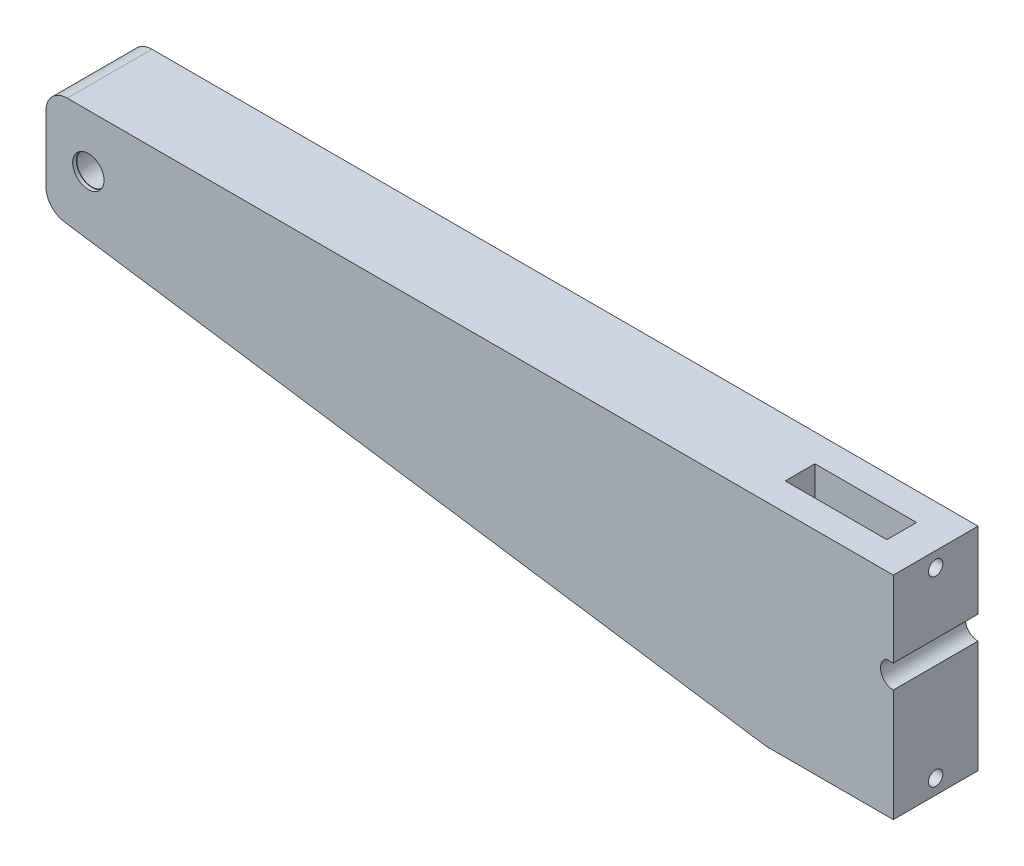
ISO-10303-21;
HEADER;
FILE_DESCRIPTION(('STEP AP214'),'2;1');
FILE_NAME('part.step','',(''),(''),'','','');
FILE_SCHEMA(('AUTOMOTIVE_DESIGN { 1 0 10303 214 1 1 1 1 }'));
ENDSEC;
DATA;
#1=APPLICATION_CONTEXT('core data for automotive mechanical design processes');
#2=APPLICATION_PROTOCOL_DEFINITION('international standard','automotive_design',2000,#1);
#3=PRODUCT_CONTEXT('',#1,'mechanical');
#4=PRODUCT('Part','Part','',(#3));
#5=PRODUCT_RELATED_PRODUCT_CATEGORY('part','',(#4));
#6=PRODUCT_DEFINITION_FORMATION('','',#4);
#7=PRODUCT_DEFINITION_CONTEXT('part definition',#1,'design');
#8=PRODUCT_DEFINITION('design','',#6,#7);
#9=PRODUCT_DEFINITION_SHAPE('','',#8);
#10=(LENGTH_UNIT() NAMED_UNIT(*) SI_UNIT(.MILLI.,.METRE.));
#11=(NAMED_UNIT(*) PLANE_ANGLE_UNIT() SI_UNIT($,.RADIAN.));
#12=(NAMED_UNIT(*) SI_UNIT($,.STERADIAN.) SOLID_ANGLE_UNIT());
#13=UNCERTAINTY_MEASURE_WITH_UNIT(LENGTH_MEASURE(1.E-05),#10,'distance_accuracy_value','');
#14=(GEOMETRIC_REPRESENTATION_CONTEXT(3) GLOBAL_UNCERTAINTY_ASSIGNED_CONTEXT((#13)) GLOBAL_UNIT_ASSIGNED_CONTEXT((#10,
#11,#12)) REPRESENTATION_CONTEXT('',''));
#15=CARTESIAN_POINT('',(0.,0.,0.));
#16=DIRECTION('',(0.,0.,1.));
#17=DIRECTION('',(1.,0.,0.));
#18=AXIS2_PLACEMENT_3D('',#15,#16,#17);
#19=CARTESIAN_POINT('',(-190.,37.5,20.));
#20=DIRECTION('',(0.,0.,-1.));
#21=DIRECTION('',(-1.,0.,0.));
#22=AXIS2_PLACEMENT_3D('',#19,#20,#21);
#23=CYLINDRICAL_SURFACE('',#22,3.575);
#24=CARTESIAN_POINT('',(-190.,37.5,19.15));
#25=DIRECTION('',(0.,0.,1.));
#26=DIRECTION('',(1.,0.,0.));
#27=AXIS2_PLACEMENT_3D('',#24,#25,#26);
#28=CIRCLE('',#27,3.575);
#29=CARTESIAN_POINT('',(-186.425,37.5,19.15));
#30=VERTEX_POINT('',#29);
#31=EDGE_CURVE('E326',#30,#30,#28,.T.);
#32=ORIENTED_EDGE('',*,*,#31,.T.);
#33=EDGE_LOOP('',(#32));
#34=FACE_BOUND('',#33,.T.);
#35=CARTESIAN_POINT('',(-190.,37.5,0.85));
#36=DIRECTION('',(0.,0.,-1.));
#37=DIRECTION('',(-1.,0.,0.));
#38=AXIS2_PLACEMENT_3D('',#35,#36,#37);
#39=CIRCLE('',#38,3.575);
#40=CARTESIAN_POINT('',(-193.575,37.5,0.85));
#41=VERTEX_POINT('',#40);
#42=EDGE_CURVE('E39',#41,#41,#39,.T.);
#43=ORIENTED_EDGE('',*,*,#42,.T.);
#44=EDGE_LOOP('',(#43));
#45=FACE_BOUND('',#44,.T.);
#46=ADVANCED_FACE('F35',(#34,#45),#23,.F.);
#47=CARTESIAN_POINT('',(-0.635055038103302,-4.31837425910245,20.));
#48=DIRECTION('',(-0.145493990494831,-0.989359135364853,0.));
#49=DIRECTION('',(0.989359135364853,-0.145493990494831,0.));
#50=AXIS2_PLACEMENT_3D('',#47,#48,#49);
#51=PLANE('',#50);
#52=DIRECTION('',(0.,0.,-1.));
#53=VECTOR('',#52,1.);
#54=CARTESIAN_POINT('',(-30.,0.,20.));
#55=LINE('',#54,#53);
#56=CARTESIAN_POINT('',(-30.,0.,6.5));
#57=VERTEX_POINT('',#56);
#58=CARTESIAN_POINT('',(-30.,0.,0.));
#59=VERTEX_POINT('',#58);
#60=EDGE_CURVE('E296',#57,#59,#55,.T.);
#61=ORIENTED_EDGE('',*,*,#60,.F.);
#62=DIRECTION('',(-0.989359135364853,0.145493990494831,0.));
#63=VECTOR('',#62,1.);
#64=CARTESIAN_POINT('',(-0.635055038103304,-4.31837425910245,6.5));
#65=LINE('',#64,#63);
#66=CARTESIAN_POINT('',(-32.,0.294117647058823,6.5));
#67=VERTEX_POINT('',#66);
#68=EDGE_CURVE('E208',#57,#67,#65,.T.);
#69=ORIENTED_EDGE('',*,*,#68,.T.);
#70=DIRECTION('',(0.,0.,1.));
#71=VECTOR('',#70,1.);
#72=CARTESIAN_POINT('',(-32.,0.294117647058823,20.));
#73=LINE('',#72,#71);
#74=CARTESIAN_POINT('',(-32.,0.294117647058824,13.5));
#75=VERTEX_POINT('',#74);
#76=EDGE_CURVE('E11',#67,#75,#73,.T.);
#77=ORIENTED_EDGE('',*,*,#76,.T.);
#78=DIRECTION('',(0.989359135364853,-0.145493990494831,0.));
#79=VECTOR('',#78,1.);
#80=CARTESIAN_POINT('',(-0.635055038103301,-4.31837425910245,13.5));
#81=LINE('',#80,#79);
#82=CARTESIAN_POINT('',(-30.,0.,13.5));
#83=VERTEX_POINT('',#82);
#84=EDGE_CURVE('E201',#75,#83,#81,.T.);
#85=ORIENTED_EDGE('',*,*,#84,.T.);
#86=CARTESIAN_POINT('',(-30.,0.,20.));
#87=VERTEX_POINT('',#86);
#88=EDGE_CURVE('E297',#87,#83,#55,.T.);
#89=ORIENTED_EDGE('',*,*,#88,.F.);
#90=DIRECTION('',(-0.989359135364853,0.145493990494831,0.));
#91=VECTOR('',#90,1.);
#92=CARTESIAN_POINT('',(-0.635055038103302,-4.31837425910245,20.));
#93=LINE('',#92,#91);
#94=CARTESIAN_POINT('',(-195.727469952474,24.3716867577168,20.));
#95=VERTEX_POINT('',#94);
#96=EDGE_CURVE('E263',#87,#95,#93,.T.);
#97=ORIENTED_EDGE('',*,*,#96,.T.);
#98=DIRECTION('',(0.,0.,-1.));
#99=VECTOR('',#98,1.);
#100=CARTESIAN_POINT('',(-195.727469952474,24.3716867577168,20.));
#101=LINE('',#100,#99);
#102=CARTESIAN_POINT('',(-195.727469952474,24.3716867577168,0.));
#103=VERTEX_POINT('',#102);
#104=EDGE_CURVE('E323',#95,#103,#101,.T.);
#105=ORIENTED_EDGE('',*,*,#104,.T.);
#106=DIRECTION('',(-0.989359135364853,0.145493990494831,0.));
#107=VECTOR('',#106,1.);
#108=CARTESIAN_POINT('',(-0.635055038103302,-4.31837425910245,0.));
#109=LINE('',#108,#107);
#110=EDGE_CURVE('E285',#59,#103,#109,.T.);
#111=ORIENTED_EDGE('',*,*,#110,.F.);
#112=EDGE_LOOP('',(#61,#69,#77,#85,#89,#97,#105,#111));
#113=FACE_BOUND('',#112,.T.);
#114=ADVANCED_FACE('F363',(#113),#51,.T.);
#115=CARTESIAN_POINT('',(0.,0.,20.));
#116=DIRECTION('',(0.,1.,0.));
#117=DIRECTION('',(0.,0.,1.));
#118=AXIS2_PLACEMENT_3D('',#115,#116,#117);
#119=PLANE('',#118);
#120=DIRECTION('',(-1.,0.,0.));
#121=VECTOR('',#120,1.);
#122=CARTESIAN_POINT('',(-8.,0.,6.5));
#123=LINE('',#122,#121);
#124=CARTESIAN_POINT('',(-8.,0.,6.5));
#125=VERTEX_POINT('',#124);
#126=EDGE_CURVE('E188',#125,#57,#123,.T.);
#127=ORIENTED_EDGE('',*,*,#126,.T.);
#128=ORIENTED_EDGE('',*,*,#60,.T.);
#129=DIRECTION('',(1.,0.,0.));
#130=VECTOR('',#129,1.);
#131=CARTESIAN_POINT('',(0.,0.,0.));
#132=LINE('',#131,#130);
#133=CARTESIAN_POINT('',(0.,0.,0.));
#134=VERTEX_POINT('',#133);
#135=EDGE_CURVE('E288',#59,#134,#132,.T.);
#136=ORIENTED_EDGE('',*,*,#135,.T.);
#137=DIRECTION('',(0.,0.,-1.));
#138=VECTOR('',#137,1.);
#139=CARTESIAN_POINT('',(0.,0.,20.));
#140=LINE('',#139,#138);
#141=CARTESIAN_POINT('',(0.,0.,20.));
#142=VERTEX_POINT('',#141);
#143=EDGE_CURVE('E294',#142,#134,#140,.T.);
#144=ORIENTED_EDGE('',*,*,#143,.F.);
#145=DIRECTION('',(1.,0.,0.));
#146=VECTOR('',#145,1.);
#147=CARTESIAN_POINT('',(0.,0.,20.));
#148=LINE('',#147,#146);
#149=EDGE_CURVE('E266',#87,#142,#148,.T.);
#150=ORIENTED_EDGE('',*,*,#149,.F.);
#151=ORIENTED_EDGE('',*,*,#88,.T.);
#152=DIRECTION('',(-1.,0.,0.));
#153=VECTOR('',#152,1.);
#154=CARTESIAN_POINT('',(0.,0.,13.5));
#155=LINE('',#154,#153);
#156=CARTESIAN_POINT('',(-8.,0.,13.5));
#157=VERTEX_POINT('',#156);
#158=EDGE_CURVE('E44',#157,#83,#155,.T.);
#159=ORIENTED_EDGE('',*,*,#158,.F.);
#160=DIRECTION('',(0.,0.,-1.));
#161=VECTOR('',#160,1.);
#162=CARTESIAN_POINT('',(-8.,0.,6.5));
#163=LINE('',#162,#161);
#164=EDGE_CURVE('E52',#157,#125,#163,.T.);
#165=ORIENTED_EDGE('',*,*,#164,.T.);
#166=EDGE_LOOP('',(#127,#128,#136,#144,#150,#151,#159,#165));
#167=FACE_BOUND('',#166,.T.);
#168=ADVANCED_FACE('F368',(#167),#119,.F.);
#169=CARTESIAN_POINT('',(0.,29.5,20.));
#170=DIRECTION('',(0.,0.,-1.));
#171=DIRECTION('',(-1.,0.,0.));
#172=AXIS2_PLACEMENT_3D('',#169,#170,#171);
#173=CYLINDRICAL_SURFACE('',#172,3.);
#174=CARTESIAN_POINT('',(0.,29.5,0.));
#175=DIRECTION('',(0.,0.,1.));
#176=DIRECTION('',(1.,0.,0.));
#177=AXIS2_PLACEMENT_3D('',#174,#175,#176);
#178=CIRCLE('',#177,3.);
#179=CARTESIAN_POINT('',(-1.65831239517769,32.,0.));
#180=VERTEX_POINT('',#179);
#181=CARTESIAN_POINT('',(0.,26.5,0.));
#182=VERTEX_POINT('',#181);
#183=EDGE_CURVE('E242',#180,#182,#178,.T.);
#184=ORIENTED_EDGE('',*,*,#183,.F.);
#185=DIRECTION('',(0.,0.,-1.));
#186=VECTOR('',#185,1.);
#187=CARTESIAN_POINT('',(-1.65831239517769,32.,20.));
#188=LINE('',#187,#186);
#189=CARTESIAN_POINT('',(-1.65831239517769,32.,20.));
#190=VERTEX_POINT('',#189);
#191=EDGE_CURVE('E306',#190,#180,#188,.T.);
#192=ORIENTED_EDGE('',*,*,#191,.F.);
#193=CARTESIAN_POINT('',(0.,29.5,20.));
#194=DIRECTION('',(0.,0.,1.));
#195=DIRECTION('',(1.,0.,0.));
#196=AXIS2_PLACEMENT_3D('',#193,#194,#195);
#197=CIRCLE('',#196,3.);
#198=CARTESIAN_POINT('',(0.,26.5,20.));
#199=VERTEX_POINT('',#198);
#200=EDGE_CURVE('E248',#190,#199,#197,.T.);
#201=ORIENTED_EDGE('',*,*,#200,.T.);
#202=DIRECTION('',(0.,0.,-1.));
#203=VECTOR('',#202,1.);
#204=CARTESIAN_POINT('',(0.,26.5,20.));
#205=LINE('',#204,#203);
#206=EDGE_CURVE('E271',#199,#182,#205,.T.);
#207=ORIENTED_EDGE('',*,*,#206,.T.);
#208=EDGE_LOOP('',(#184,#192,#201,#207));
#209=FACE_BOUND('',#208,.T.);
#210=ADVANCED_FACE('F372',(#209),#173,.F.);
#211=CARTESIAN_POINT('',(1.3389793477437E-13,32.,20.));
#212=DIRECTION('',(0.,1.,0.));
#213=DIRECTION('',(-1.,0.,0.));
#214=AXIS2_PLACEMENT_3D('',#211,#212,#213);
#215=PLANE('',#214);
#216=DIRECTION('',(1.,0.,0.));
#217=VECTOR('',#216,1.);
#218=CARTESIAN_POINT('',(1.3389793477437E-13,32.,0.));
#219=LINE('',#218,#217);
#220=CARTESIAN_POINT('',(0.,32.,0.));
#221=VERTEX_POINT('',#220);
#222=EDGE_CURVE('E274',#180,#221,#219,.T.);
#223=ORIENTED_EDGE('',*,*,#222,.T.);
#224=DIRECTION('',(0.,0.,-1.));
#225=VECTOR('',#224,1.);
#226=CARTESIAN_POINT('',(0.,32.,20.));
#227=LINE('',#226,#225);
#228=CARTESIAN_POINT('',(0.,32.,20.));
#229=VERTEX_POINT('',#228);
#230=EDGE_CURVE('E303',#229,#221,#227,.T.);
#231=ORIENTED_EDGE('',*,*,#230,.F.);
#232=DIRECTION('',(1.,0.,0.));
#233=VECTOR('',#232,1.);
#234=CARTESIAN_POINT('',(1.3389793477437E-13,32.,20.));
#235=LINE('',#234,#233);
#236=EDGE_CURVE('E251',#190,#229,#235,.T.);
#237=ORIENTED_EDGE('',*,*,#236,.F.);
#238=ORIENTED_EDGE('',*,*,#191,.T.);
#239=EDGE_LOOP('',(#223,#231,#237,#238));
#240=FACE_BOUND('',#239,.T.);
#241=ADVANCED_FACE('F416',(#240),#215,.F.);
#242=CARTESIAN_POINT('',(0.,0.,20.));
#243=DIRECTION('',(-1.,0.,0.));
#244=DIRECTION('',(0.,0.,1.));
#245=AXIS2_PLACEMENT_3D('',#242,#243,#244);
#246=PLANE('',#245);
#247=CARTESIAN_POINT('',(0.,46.5,10.));
#248=DIRECTION('',(-1.,0.,0.));
#249=DIRECTION('',(0.,0.,1.));
#250=AXIS2_PLACEMENT_3D('',#247,#248,#249);
#251=CIRCLE('',#250,1.7);
#252=CARTESIAN_POINT('',(0.,46.5,11.7));
#253=VERTEX_POINT('',#252);
#254=EDGE_CURVE('E214',#253,#253,#251,.F.);
#255=ORIENTED_EDGE('',*,*,#254,.F.);
#256=EDGE_LOOP('',(#255));
#257=FACE_BOUND('',#256,.T.);
#258=DIRECTION('',(0.,1.,0.));
#259=VECTOR('',#258,1.);
#260=CARTESIAN_POINT('',(0.,0.,0.));
#261=LINE('',#260,#259);
#262=CARTESIAN_POINT('',(0.,50.,0.));
#263=VERTEX_POINT('',#262);
#264=EDGE_CURVE('E277',#221,#263,#261,.T.);
#265=ORIENTED_EDGE('',*,*,#264,.T.);
#266=DIRECTION('',(0.,0.,-1.));
#267=VECTOR('',#266,1.);
#268=CARTESIAN_POINT('',(0.,50.,20.));
#269=LINE('',#268,#267);
#270=CARTESIAN_POINT('',(0.,50.,20.));
#271=VERTEX_POINT('',#270);
#272=EDGE_CURVE('E300',#271,#263,#269,.T.);
#273=ORIENTED_EDGE('',*,*,#272,.F.);
#274=DIRECTION('',(0.,1.,0.));
#275=VECTOR('',#274,1.);
#276=CARTESIAN_POINT('',(0.,0.,20.));
#277=LINE('',#276,#275);
#278=EDGE_CURVE('E255',#229,#271,#277,.T.);
#279=ORIENTED_EDGE('',*,*,#278,.F.);
#280=ORIENTED_EDGE('',*,*,#230,.T.);
#281=EDGE_LOOP('',(#265,#273,#279,#280));
#282=FACE_BOUND('',#281,.T.);
#283=ADVANCED_FACE('F419',(#257,#282),#246,.F.);
#284=CARTESIAN_POINT('',(0.,50.,20.));
#285=DIRECTION('',(0.,1.,0.));
#286=DIRECTION('',(0.,0.,1.));
#287=AXIS2_PLACEMENT_3D('',#284,#285,#286);
#288=PLANE('',#287);
#289=DIRECTION('',(0.,0.,-1.));
#290=VECTOR('',#289,1.);
#291=CARTESIAN_POINT('',(-8.,50.,6.5));
#292=LINE('',#291,#290);
#293=CARTESIAN_POINT('',(-8.,50.,13.5));
#294=VERTEX_POINT('',#293);
#295=CARTESIAN_POINT('',(-8.,50.,6.5));
#296=VERTEX_POINT('',#295);
#297=EDGE_CURVE('E60',#294,#296,#292,.T.);
#298=ORIENTED_EDGE('',*,*,#297,.F.);
#299=DIRECTION('',(1.,0.,0.));
#300=VECTOR('',#299,1.);
#301=CARTESIAN_POINT('',(-8.,50.,13.5));
#302=LINE('',#301,#300);
#303=CARTESIAN_POINT('',(-32.,50.,13.5));
#304=VERTEX_POINT('',#303);
#305=EDGE_CURVE('E221',#304,#294,#302,.T.);
#306=ORIENTED_EDGE('',*,*,#305,.F.);
#307=DIRECTION('',(0.,0.,1.));
#308=VECTOR('',#307,1.);
#309=CARTESIAN_POINT('',(-32.,50.,6.5));
#310=LINE('',#309,#308);
#311=CARTESIAN_POINT('',(-32.,50.,6.5));
#312=VERTEX_POINT('',#311);
#313=EDGE_CURVE('E235',#312,#304,#310,.T.);
#314=ORIENTED_EDGE('',*,*,#313,.F.);
#315=DIRECTION('',(-1.,0.,0.));
#316=VECTOR('',#315,1.);
#317=CARTESIAN_POINT('',(-8.,50.,6.5));
#318=LINE('',#317,#316);
#319=EDGE_CURVE('E232',#296,#312,#318,.T.);
#320=ORIENTED_EDGE('',*,*,#319,.F.);
#321=EDGE_LOOP('',(#298,#306,#314,#320));
#322=FACE_BOUND('',#321,.T.);
#323=DIRECTION('',(1.,0.,0.));
#324=VECTOR('',#323,1.);
#325=CARTESIAN_POINT('',(0.,50.,0.));
#326=LINE('',#325,#324);
#327=CARTESIAN_POINT('',(-195.,50.,0.));
#328=VERTEX_POINT('',#327);
#329=EDGE_CURVE('E280',#328,#263,#326,.T.);
#330=ORIENTED_EDGE('',*,*,#329,.F.);
#331=DIRECTION('',(0.,0.,-1.));
#332=VECTOR('',#331,1.);
#333=CARTESIAN_POINT('',(-195.,50.,20.));
#334=LINE('',#333,#332);
#335=CARTESIAN_POINT('',(-195.,50.,20.));
#336=VERTEX_POINT('',#335);
#337=EDGE_CURVE('E317',#328,#336,#334,.F.);
#338=ORIENTED_EDGE('',*,*,#337,.T.);
#339=DIRECTION('',(1.,0.,0.));
#340=VECTOR('',#339,1.);
#341=CARTESIAN_POINT('',(0.,50.,20.));
#342=LINE('',#341,#340);
#343=EDGE_CURVE('E258',#336,#271,#342,.T.);
#344=ORIENTED_EDGE('',*,*,#343,.T.);
#345=ORIENTED_EDGE('',*,*,#272,.T.);
#346=EDGE_LOOP('',(#330,#338,#344,#345));
#347=FACE_BOUND('',#346,.T.);
#348=ADVANCED_FACE('F422',(#322,#347),#288,.T.);
#349=CARTESIAN_POINT('',(-200.,0.,20.));
#350=DIRECTION('',(-1.,0.,0.));
#351=DIRECTION('',(0.,0.,1.));
#352=AXIS2_PLACEMENT_3D('',#349,#350,#351);
#353=PLANE('',#352);
#354=DIRECTION('',(0.,1.,0.));
#355=VECTOR('',#354,1.);
#356=CARTESIAN_POINT('',(-200.,0.,20.));
#357=LINE('',#356,#355);
#358=CARTESIAN_POINT('',(-200.,29.3184824345411,20.));
#359=VERTEX_POINT('',#358);
#360=CARTESIAN_POINT('',(-200.,45.,20.));
#361=VERTEX_POINT('',#360);
#362=EDGE_CURVE('E260',#359,#361,#357,.T.);
#363=ORIENTED_EDGE('',*,*,#362,.T.);
#364=DIRECTION('',(0.,0.,-1.));
#365=VECTOR('',#364,1.);
#366=CARTESIAN_POINT('',(-200.,45.,20.));
#367=LINE('',#366,#365);
#368=CARTESIAN_POINT('',(-200.,45.,0.));
#369=VERTEX_POINT('',#368);
#370=EDGE_CURVE('E310',#361,#369,#367,.T.);
#371=ORIENTED_EDGE('',*,*,#370,.T.);
#372=DIRECTION('',(0.,1.,0.));
#373=VECTOR('',#372,1.);
#374=CARTESIAN_POINT('',(-200.,0.,0.));
#375=LINE('',#374,#373);
#376=CARTESIAN_POINT('',(-200.,29.3184824345411,0.));
#377=VERTEX_POINT('',#376);
#378=EDGE_CURVE('E282',#377,#369,#375,.T.);
#379=ORIENTED_EDGE('',*,*,#378,.F.);
#380=DIRECTION('',(0.,0.,-1.));
#381=VECTOR('',#380,1.);
#382=CARTESIAN_POINT('',(-200.,29.3184824345411,20.));
#383=LINE('',#382,#381);
#384=EDGE_CURVE('E308',#377,#359,#383,.F.);
#385=ORIENTED_EDGE('',*,*,#384,.T.);
#386=EDGE_LOOP('',(#363,#371,#379,#385));
#387=FACE_BOUND('',#386,.T.);
#388=ADVANCED_FACE('F395',(#387),#353,.T.);
#389=CARTESIAN_POINT('',(0.,0.,20.));
#390=DIRECTION('',(1.,0.,0.));
#391=DIRECTION('',(0.,1.,0.));
#392=AXIS2_PLACEMENT_3D('',#389,#390,#391);
#393=PLANE('',#392);
#394=CARTESIAN_POINT('',(0.,3.5,10.));
#395=DIRECTION('',(-1.,0.,0.));
#396=DIRECTION('',(0.,0.,1.));
#397=AXIS2_PLACEMENT_3D('',#394,#395,#396);
#398=CIRCLE('',#397,1.7);
#399=CARTESIAN_POINT('',(0.,3.5,11.7));
#400=VERTEX_POINT('',#399);
#401=EDGE_CURVE('E193',#400,#400,#398,.T.);
#402=ORIENTED_EDGE('',*,*,#401,.T.);
#403=EDGE_LOOP('',(#402));
#404=FACE_BOUND('',#403,.T.);
#405=DIRECTION('',(0.,-1.,0.));
#406=VECTOR('',#405,1.);
#407=CARTESIAN_POINT('',(0.,0.,0.));
#408=LINE('',#407,#406);
#409=EDGE_CURVE('E252',#182,#134,#408,.T.);
#410=ORIENTED_EDGE('',*,*,#409,.F.);
#411=ORIENTED_EDGE('',*,*,#206,.F.);
#412=DIRECTION('',(0.,-1.,0.));
#413=VECTOR('',#412,1.);
#414=CARTESIAN_POINT('',(0.,0.,20.));
#415=LINE('',#414,#413);
#416=EDGE_CURVE('E268',#199,#142,#415,.T.);
#417=ORIENTED_EDGE('',*,*,#416,.T.);
#418=ORIENTED_EDGE('',*,*,#143,.T.);
#419=EDGE_LOOP('',(#410,#411,#417,#418));
#420=FACE_BOUND('',#419,.T.);
#421=ADVANCED_FACE('F409',(#404,#420),#393,.T.);
#422=CARTESIAN_POINT('',(0.,0.,20.));
#423=DIRECTION('',(0.,0.,1.));
#424=DIRECTION('',(1.,0.,0.));
#425=AXIS2_PLACEMENT_3D('',#422,#423,#424);
#426=PLANE('',#425);
#427=CARTESIAN_POINT('',(-190.,37.5,20.));
#428=DIRECTION('',(0.,0.,1.));
#429=DIRECTION('',(1.,0.,0.));
#430=AXIS2_PLACEMENT_3D('',#427,#428,#429);
#431=CIRCLE('',#430,3.70000000000001);
#432=CARTESIAN_POINT('',(-186.3,37.5,20.));
#433=VERTEX_POINT('',#432);
#434=EDGE_CURVE('E334',#433,#433,#431,.T.);
#435=ORIENTED_EDGE('',*,*,#434,.F.);
#436=EDGE_LOOP('',(#435));
#437=FACE_BOUND('',#436,.T.);
#438=ORIENTED_EDGE('',*,*,#343,.F.);
#439=CARTESIAN_POINT('',(-195.,45.,20.));
#440=DIRECTION('',(0.,0.,1.));
#441=DIRECTION('',(1.,0.,0.));
#442=AXIS2_PLACEMENT_3D('',#439,#440,#441);
#443=CIRCLE('',#442,5.);
#444=EDGE_CURVE('E321',#336,#361,#443,.T.);
#445=ORIENTED_EDGE('',*,*,#444,.T.);
#446=ORIENTED_EDGE('',*,*,#362,.F.);
#447=CARTESIAN_POINT('',(-195.,29.3184824345411,20.));
#448=DIRECTION('',(0.,0.,1.));
#449=DIRECTION('',(1.,0.,0.));
#450=AXIS2_PLACEMENT_3D('',#447,#448,#449);
#451=CIRCLE('',#450,5.);
#452=EDGE_CURVE('E319',#359,#95,#451,.T.);
#453=ORIENTED_EDGE('',*,*,#452,.T.);
#454=ORIENTED_EDGE('',*,*,#96,.F.);
#455=ORIENTED_EDGE('',*,*,#149,.T.);
#456=ORIENTED_EDGE('',*,*,#416,.F.);
#457=ORIENTED_EDGE('',*,*,#200,.F.);
#458=ORIENTED_EDGE('',*,*,#236,.T.);
#459=ORIENTED_EDGE('',*,*,#278,.T.);
#460=EDGE_LOOP('',(#438,#445,#446,#453,#454,#455,#456,#457,#458,#459));
#461=FACE_BOUND('',#460,.T.);
#462=ADVANCED_FACE('F384',(#437,#461),#426,.T.);
#463=CARTESIAN_POINT('',(0.,0.,0.));
#464=DIRECTION('',(0.,0.,1.));
#465=DIRECTION('',(1.,0.,0.));
#466=AXIS2_PLACEMENT_3D('',#463,#464,#465);
#467=PLANE('',#466);
#468=CARTESIAN_POINT('',(-190.,37.5,0.));
#469=DIRECTION('',(0.,0.,1.));
#470=DIRECTION('',(1.,0.,0.));
#471=AXIS2_PLACEMENT_3D('',#468,#469,#470);
#472=CIRCLE('',#471,3.70000000000001);
#473=CARTESIAN_POINT('',(-186.3,37.5,0.));
#474=VERTEX_POINT('',#473);
#475=EDGE_CURVE('E341',#474,#474,#472,.T.);
#476=ORIENTED_EDGE('',*,*,#475,.T.);
#477=EDGE_LOOP('',(#476));
#478=FACE_BOUND('',#477,.T.);
#479=ORIENTED_EDGE('',*,*,#378,.T.);
#480=CARTESIAN_POINT('',(-195.,45.,0.));
#481=DIRECTION('',(0.,0.,1.));
#482=DIRECTION('',(1.,0.,0.));
#483=AXIS2_PLACEMENT_3D('',#480,#481,#482);
#484=CIRCLE('',#483,5.);
#485=EDGE_CURVE('E315',#369,#328,#484,.F.);
#486=ORIENTED_EDGE('',*,*,#485,.T.);
#487=ORIENTED_EDGE('',*,*,#329,.T.);
#488=ORIENTED_EDGE('',*,*,#264,.F.);
#489=ORIENTED_EDGE('',*,*,#222,.F.);
#490=ORIENTED_EDGE('',*,*,#183,.T.);
#491=ORIENTED_EDGE('',*,*,#409,.T.);
#492=ORIENTED_EDGE('',*,*,#135,.F.);
#493=ORIENTED_EDGE('',*,*,#110,.T.);
#494=CARTESIAN_POINT('',(-195.,29.3184824345411,0.));
#495=DIRECTION('',(0.,0.,1.));
#496=DIRECTION('',(1.,0.,0.));
#497=AXIS2_PLACEMENT_3D('',#494,#495,#496);
#498=CIRCLE('',#497,5.);
#499=EDGE_CURVE('E313',#103,#377,#498,.F.);
#500=ORIENTED_EDGE('',*,*,#499,.T.);
#501=EDGE_LOOP('',(#479,#486,#487,#488,#489,#490,#491,#492,#493,#500));
#502=FACE_BOUND('',#501,.T.);
#503=ADVANCED_FACE('F376',(#478,#502),#467,.F.);
#504=CARTESIAN_POINT('',(-195.,45.,20.));
#505=DIRECTION('',(0.,0.,-1.));
#506=DIRECTION('',(-1.,0.,0.));
#507=AXIS2_PLACEMENT_3D('',#504,#505,#506);
#508=CYLINDRICAL_SURFACE('',#507,5.);
#509=ORIENTED_EDGE('',*,*,#444,.F.);
#510=ORIENTED_EDGE('',*,*,#337,.F.);
#511=ORIENTED_EDGE('',*,*,#485,.F.);
#512=ORIENTED_EDGE('',*,*,#370,.F.);
#513=EDGE_LOOP('',(#509,#510,#511,#512));
#514=FACE_BOUND('',#513,.T.);
#515=ADVANCED_FACE('F374',(#514),#508,.T.);
#516=CARTESIAN_POINT('',(-195.,29.3184824345411,20.));
#517=DIRECTION('',(0.,0.,-1.));
#518=DIRECTION('',(-1.,0.,0.));
#519=AXIS2_PLACEMENT_3D('',#516,#517,#518);
#520=CYLINDRICAL_SURFACE('',#519,5.);
#521=ORIENTED_EDGE('',*,*,#452,.F.);
#522=ORIENTED_EDGE('',*,*,#384,.F.);
#523=ORIENTED_EDGE('',*,*,#499,.F.);
#524=ORIENTED_EDGE('',*,*,#104,.F.);
#525=EDGE_LOOP('',(#521,#522,#523,#524));
#526=FACE_BOUND('',#525,.T.);
#527=ADVANCED_FACE('F37',(#526),#520,.T.);
#528=CARTESIAN_POINT('',(-8.,43.,6.5));
#529=DIRECTION('',(1.,0.,0.));
#530=DIRECTION('',(0.,0.,-1.));
#531=AXIS2_PLACEMENT_3D('',#528,#529,#530);
#532=PLANE('',#531);
#533=CARTESIAN_POINT('',(-8.,46.5,10.));
#534=DIRECTION('',(-1.,0.,0.));
#535=DIRECTION('',(0.,0.,1.));
#536=AXIS2_PLACEMENT_3D('',#533,#534,#535);
#537=CIRCLE('',#536,1.7);
#538=CARTESIAN_POINT('',(-8.,46.5,11.7));
#539=VERTEX_POINT('',#538);
#540=EDGE_CURVE('E211',#539,#539,#537,.T.);
#541=ORIENTED_EDGE('',*,*,#540,.F.);
#542=EDGE_LOOP('',(#541));
#543=FACE_BOUND('',#542,.T.);
#544=ORIENTED_EDGE('',*,*,#297,.T.);
#545=DIRECTION('',(0.,1.,0.));
#546=VECTOR('',#545,1.);
#547=CARTESIAN_POINT('',(-8.,43.,6.5));
#548=LINE('',#547,#546);
#549=CARTESIAN_POINT('',(-8.,43.,6.5));
#550=VERTEX_POINT('',#549);
#551=EDGE_CURVE('E230',#550,#296,#548,.T.);
#552=ORIENTED_EDGE('',*,*,#551,.F.);
#553=DIRECTION('',(0.,0.,-1.));
#554=VECTOR('',#553,1.);
#555=CARTESIAN_POINT('',(-8.,43.,6.5));
#556=LINE('',#555,#554);
#557=CARTESIAN_POINT('',(-8.,43.,13.5));
#558=VERTEX_POINT('',#557);
#559=EDGE_CURVE('E217',#558,#550,#556,.T.);
#560=ORIENTED_EDGE('',*,*,#559,.F.);
#561=DIRECTION('',(0.,1.,0.));
#562=VECTOR('',#561,1.);
#563=CARTESIAN_POINT('',(-8.,43.,13.5));
#564=LINE('',#563,#562);
#565=EDGE_CURVE('E240',#558,#294,#564,.T.);
#566=ORIENTED_EDGE('',*,*,#565,.T.);
#567=EDGE_LOOP('',(#544,#552,#560,#566));
#568=FACE_BOUND('',#567,.T.);
#569=ADVANCED_FACE('F382',(#543,#568),#532,.F.);
#570=CARTESIAN_POINT('',(-8.,43.,13.5));
#571=DIRECTION('',(0.,0.,1.));
#572=DIRECTION('',(1.,0.,0.));
#573=AXIS2_PLACEMENT_3D('',#570,#571,#572);
#574=PLANE('',#573);
#575=ORIENTED_EDGE('',*,*,#305,.T.);
#576=ORIENTED_EDGE('',*,*,#565,.F.);
#577=DIRECTION('',(1.,0.,0.));
#578=VECTOR('',#577,1.);
#579=CARTESIAN_POINT('',(-8.,43.,13.5));
#580=LINE('',#579,#578);
#581=CARTESIAN_POINT('',(-32.,43.,13.5));
#582=VERTEX_POINT('',#581);
#583=EDGE_CURVE('E227',#582,#558,#580,.T.);
#584=ORIENTED_EDGE('',*,*,#583,.F.);
#585=DIRECTION('',(0.,1.,0.));
#586=VECTOR('',#585,1.);
#587=CARTESIAN_POINT('',(-32.,43.,13.5));
#588=LINE('',#587,#586);
#589=EDGE_CURVE('E243',#582,#304,#588,.T.);
#590=ORIENTED_EDGE('',*,*,#589,.T.);
#591=EDGE_LOOP('',(#575,#576,#584,#590));
#592=FACE_BOUND('',#591,.T.);
#593=ADVANCED_FACE('F452',(#592),#574,.F.);
#594=CARTESIAN_POINT('',(-32.,43.,6.5));
#595=DIRECTION('',(-1.,0.,0.));
#596=DIRECTION('',(0.,0.,1.));
#597=AXIS2_PLACEMENT_3D('',#594,#595,#596);
#598=PLANE('',#597);
#599=ORIENTED_EDGE('',*,*,#313,.T.);
#600=ORIENTED_EDGE('',*,*,#589,.F.);
#601=DIRECTION('',(0.,0.,1.));
#602=VECTOR('',#601,1.);
#603=CARTESIAN_POINT('',(-32.,43.,6.5));
#604=LINE('',#603,#602);
#605=CARTESIAN_POINT('',(-32.,43.,6.5));
#606=VERTEX_POINT('',#605);
#607=EDGE_CURVE('E224',#606,#582,#604,.T.);
#608=ORIENTED_EDGE('',*,*,#607,.F.);
#609=DIRECTION('',(0.,1.,0.));
#610=VECTOR('',#609,1.);
#611=CARTESIAN_POINT('',(-32.,43.,6.5));
#612=LINE('',#611,#610);
#613=EDGE_CURVE('E245',#606,#312,#612,.T.);
#614=ORIENTED_EDGE('',*,*,#613,.T.);
#615=EDGE_LOOP('',(#599,#600,#608,#614));
#616=FACE_BOUND('',#615,.T.);
#617=ADVANCED_FACE('F455',(#616),#598,.F.);
#618=CARTESIAN_POINT('',(-8.,43.,6.5));
#619=DIRECTION('',(0.,0.,-1.));
#620=DIRECTION('',(-1.,0.,0.));
#621=AXIS2_PLACEMENT_3D('',#618,#619,#620);
#622=PLANE('',#621);
#623=ORIENTED_EDGE('',*,*,#319,.T.);
#624=ORIENTED_EDGE('',*,*,#613,.F.);
#625=DIRECTION('',(-1.,0.,0.));
#626=VECTOR('',#625,1.);
#627=CARTESIAN_POINT('',(-8.,43.,6.5));
#628=LINE('',#627,#626);
#629=EDGE_CURVE('E220',#550,#606,#628,.T.);
#630=ORIENTED_EDGE('',*,*,#629,.F.);
#631=ORIENTED_EDGE('',*,*,#551,.T.);
#632=EDGE_LOOP('',(#623,#624,#630,#631));
#633=FACE_BOUND('',#632,.T.);
#634=ADVANCED_FACE('F450',(#633),#622,.F.);
#635=CARTESIAN_POINT('',(0.,43.,0.));
#636=DIRECTION('',(0.,-1.,0.));
#637=DIRECTION('',(0.,0.,-1.));
#638=AXIS2_PLACEMENT_3D('',#635,#636,#637);
#639=PLANE('',#638);
#640=ORIENTED_EDGE('',*,*,#559,.T.);
#641=ORIENTED_EDGE('',*,*,#629,.T.);
#642=ORIENTED_EDGE('',*,*,#607,.T.);
#643=ORIENTED_EDGE('',*,*,#583,.T.);
#644=EDGE_LOOP('',(#640,#641,#642,#643));
#645=FACE_BOUND('',#644,.T.);
#646=ADVANCED_FACE('F446',(#645),#639,.F.);
#647=CARTESIAN_POINT('',(4.80832611206852,46.5,10.));
#648=DIRECTION('',(-1.,0.,0.));
#649=DIRECTION('',(0.,0.,1.));
#650=AXIS2_PLACEMENT_3D('',#647,#648,#649);
#651=CYLINDRICAL_SURFACE('',#650,1.7);
#652=ORIENTED_EDGE('',*,*,#254,.T.);
#653=EDGE_LOOP('',(#652));
#654=FACE_BOUND('',#653,.T.);
#655=ORIENTED_EDGE('',*,*,#540,.T.);
#656=EDGE_LOOP('',(#655));
#657=FACE_BOUND('',#656,.T.);
#658=ADVANCED_FACE('F442',(#654,#657),#651,.F.);
#659=CARTESIAN_POINT('',(-8.,7.,6.5));
#660=DIRECTION('',(-1.,0.,0.));
#661=DIRECTION('',(0.,0.,1.));
#662=AXIS2_PLACEMENT_3D('',#659,#660,#661);
#663=PLANE('',#662);
#664=CARTESIAN_POINT('',(-8.,3.5,10.));
#665=DIRECTION('',(1.,0.,0.));
#666=DIRECTION('',(0.,0.,1.));
#667=AXIS2_PLACEMENT_3D('',#664,#665,#666);
#668=CIRCLE('',#667,1.7);
#669=CARTESIAN_POINT('',(-8.,3.5,11.7));
#670=VERTEX_POINT('',#669);
#671=EDGE_CURVE('E328',#670,#670,#668,.T.);
#672=ORIENTED_EDGE('',*,*,#671,.T.);
#673=EDGE_LOOP('',(#672));
#674=FACE_BOUND('',#673,.T.);
#675=ORIENTED_EDGE('',*,*,#164,.F.);
#676=DIRECTION('',(0.,-1.,0.));
#677=VECTOR('',#676,1.);
#678=CARTESIAN_POINT('',(-8.,7.,13.5));
#679=LINE('',#678,#677);
#680=CARTESIAN_POINT('',(-8.,7.,13.5));
#681=VERTEX_POINT('',#680);
#682=EDGE_CURVE('E172',#681,#157,#679,.T.);
#683=ORIENTED_EDGE('',*,*,#682,.F.);
#684=DIRECTION('',(0.,0.,-1.));
#685=VECTOR('',#684,1.);
#686=CARTESIAN_POINT('',(-8.,7.,6.5));
#687=LINE('',#686,#685);
#688=CARTESIAN_POINT('',(-8.,7.,6.5));
#689=VERTEX_POINT('',#688);
#690=EDGE_CURVE('E180',#681,#689,#687,.T.);
#691=ORIENTED_EDGE('',*,*,#690,.T.);
#692=DIRECTION('',(0.,-1.,0.));
#693=VECTOR('',#692,1.);
#694=CARTESIAN_POINT('',(-8.,7.,6.5));
#695=LINE('',#694,#693);
#696=EDGE_CURVE('E199',#689,#125,#695,.T.);
#697=ORIENTED_EDGE('',*,*,#696,.T.);
#698=EDGE_LOOP('',(#675,#683,#691,#697));
#699=FACE_BOUND('',#698,.T.);
#700=ADVANCED_FACE('F183',(#674,#699),#663,.T.);
#701=CARTESIAN_POINT('',(-8.,7.,6.5));
#702=DIRECTION('',(0.,0.,1.));
#703=DIRECTION('',(1.,0.,0.));
#704=AXIS2_PLACEMENT_3D('',#701,#702,#703);
#705=PLANE('',#704);
#706=ORIENTED_EDGE('',*,*,#126,.F.);
#707=ORIENTED_EDGE('',*,*,#696,.F.);
#708=DIRECTION('',(-1.,0.,0.));
#709=VECTOR('',#708,1.);
#710=CARTESIAN_POINT('',(-8.,7.,6.5));
#711=LINE('',#710,#709);
#712=CARTESIAN_POINT('',(-32.,7.,6.5));
#713=VERTEX_POINT('',#712);
#714=EDGE_CURVE('E185',#689,#713,#711,.T.);
#715=ORIENTED_EDGE('',*,*,#714,.T.);
#716=DIRECTION('',(0.,-1.,0.));
#717=VECTOR('',#716,1.);
#718=CARTESIAN_POINT('',(-32.,7.,6.5));
#719=LINE('',#718,#717);
#720=EDGE_CURVE('E202',#713,#67,#719,.T.);
#721=ORIENTED_EDGE('',*,*,#720,.T.);
#722=ORIENTED_EDGE('',*,*,#68,.F.);
#723=EDGE_LOOP('',(#706,#707,#715,#721,#722));
#724=FACE_BOUND('',#723,.T.);
#725=ADVANCED_FACE('F426',(#724),#705,.T.);
#726=CARTESIAN_POINT('',(-32.,7.,6.5));
#727=DIRECTION('',(1.,0.,0.));
#728=DIRECTION('',(0.,0.,-1.));
#729=AXIS2_PLACEMENT_3D('',#726,#727,#728);
#730=PLANE('',#729);
#731=ORIENTED_EDGE('',*,*,#720,.F.);
#732=DIRECTION('',(0.,0.,1.));
#733=VECTOR('',#732,1.);
#734=CARTESIAN_POINT('',(-32.,7.,6.5));
#735=LINE('',#734,#733);
#736=CARTESIAN_POINT('',(-32.,7.,13.5));
#737=VERTEX_POINT('',#736);
#738=EDGE_CURVE('E179',#713,#737,#735,.T.);
#739=ORIENTED_EDGE('',*,*,#738,.T.);
#740=DIRECTION('',(0.,-1.,0.));
#741=VECTOR('',#740,1.);
#742=CARTESIAN_POINT('',(-32.,7.,13.5));
#743=LINE('',#742,#741);
#744=EDGE_CURVE('E175',#737,#75,#743,.T.);
#745=ORIENTED_EDGE('',*,*,#744,.T.);
#746=ORIENTED_EDGE('',*,*,#76,.F.);
#747=EDGE_LOOP('',(#731,#739,#745,#746));
#748=FACE_BOUND('',#747,.T.);
#749=ADVANCED_FACE('F429',(#748),#730,.T.);
#750=CARTESIAN_POINT('',(-8.,7.,13.5));
#751=DIRECTION('',(0.,0.,-1.));
#752=DIRECTION('',(-1.,0.,0.));
#753=AXIS2_PLACEMENT_3D('',#750,#751,#752);
#754=PLANE('',#753);
#755=ORIENTED_EDGE('',*,*,#744,.F.);
#756=DIRECTION('',(1.,0.,0.));
#757=VECTOR('',#756,1.);
#758=CARTESIAN_POINT('',(-8.,7.,13.5));
#759=LINE('',#758,#757);
#760=EDGE_CURVE('E170',#737,#681,#759,.T.);
#761=ORIENTED_EDGE('',*,*,#760,.T.);
#762=ORIENTED_EDGE('',*,*,#682,.T.);
#763=ORIENTED_EDGE('',*,*,#158,.T.);
#764=ORIENTED_EDGE('',*,*,#84,.F.);
#765=EDGE_LOOP('',(#755,#761,#762,#763,#764));
#766=FACE_BOUND('',#765,.T.);
#767=ADVANCED_FACE('F171',(#766),#754,.T.);
#768=CARTESIAN_POINT('',(0.,7.,0.));
#769=DIRECTION('',(0.,1.,0.));
#770=DIRECTION('',(0.,0.,-1.));
#771=AXIS2_PLACEMENT_3D('',#768,#769,#770);
#772=PLANE('',#771);
#773=ORIENTED_EDGE('',*,*,#690,.F.);
#774=ORIENTED_EDGE('',*,*,#760,.F.);
#775=ORIENTED_EDGE('',*,*,#738,.F.);
#776=ORIENTED_EDGE('',*,*,#714,.F.);
#777=EDGE_LOOP('',(#773,#774,#775,#776));
#778=FACE_BOUND('',#777,.T.);
#779=ADVANCED_FACE('F187',(#778),#772,.F.);
#780=CARTESIAN_POINT('',(4.80832611206852,3.5,10.));
#781=DIRECTION('',(-1.,0.,0.));
#782=DIRECTION('',(0.,0.,1.));
#783=AXIS2_PLACEMENT_3D('',#780,#781,#782);
#784=CYLINDRICAL_SURFACE('',#783,1.7);
#785=ORIENTED_EDGE('',*,*,#401,.F.);
#786=EDGE_LOOP('',(#785));
#787=FACE_BOUND('',#786,.T.);
#788=ORIENTED_EDGE('',*,*,#671,.F.);
#789=EDGE_LOOP('',(#788));
#790=FACE_BOUND('',#789,.T.);
#791=ADVANCED_FACE('F613',(#787,#790),#784,.F.);
#792=CARTESIAN_POINT('',(-190.,37.5,19.15));
#793=DIRECTION('',(0.,0.,1.));
#794=DIRECTION('',(1.,0.,0.));
#795=AXIS2_PLACEMENT_3D('',#792,#793,#794);
#796=CYLINDRICAL_SURFACE('',#795,3.70000000000001);
#797=CARTESIAN_POINT('',(-190.,37.5,19.15));
#798=DIRECTION('',(0.,0.,1.));
#799=DIRECTION('',(1.,0.,0.));
#800=AXIS2_PLACEMENT_3D('',#797,#798,#799);
#801=CIRCLE('',#800,3.70000000000001);
#802=CARTESIAN_POINT('',(-186.3,37.5,19.15));
#803=VERTEX_POINT('',#802);
#804=EDGE_CURVE('E329',#803,#803,#801,.T.);
#805=ORIENTED_EDGE('',*,*,#804,.F.);
#806=EDGE_LOOP('',(#805));
#807=FACE_BOUND('',#806,.T.);
#808=ORIENTED_EDGE('',*,*,#434,.T.);
#809=EDGE_LOOP('',(#808));
#810=FACE_BOUND('',#809,.T.);
#811=ADVANCED_FACE('F606',(#807,#810),#796,.F.);
#812=CARTESIAN_POINT('',(-190.,37.5,19.15));
#813=DIRECTION('',(0.,0.,1.));
#814=DIRECTION('',(1.,0.,0.));
#815=AXIS2_PLACEMENT_3D('',#812,#813,#814);
#816=PLANE('',#815);
#817=ORIENTED_EDGE('',*,*,#31,.F.);
#818=EDGE_LOOP('',(#817));
#819=FACE_BOUND('',#818,.T.);
#820=ORIENTED_EDGE('',*,*,#804,.T.);
#821=EDGE_LOOP('',(#820));
#822=FACE_BOUND('',#821,.T.);
#823=ADVANCED_FACE('F360',(#819,#822),#816,.T.);
#824=CARTESIAN_POINT('',(-190.,37.5,0.85));
#825=DIRECTION('',(0.,0.,-1.));
#826=DIRECTION('',(-1.,0.,0.));
#827=AXIS2_PLACEMENT_3D('',#824,#825,#826);
#828=CYLINDRICAL_SURFACE('',#827,3.70000000000001);
#829=CARTESIAN_POINT('',(-190.,37.5,0.85));
#830=DIRECTION('',(0.,0.,1.));
#831=DIRECTION('',(1.,0.,0.));
#832=AXIS2_PLACEMENT_3D('',#829,#830,#831);
#833=CIRCLE('',#832,3.70000000000001);
#834=CARTESIAN_POINT('',(-186.3,37.5,0.85));
#835=VERTEX_POINT('',#834);
#836=EDGE_CURVE('E344',#835,#835,#833,.T.);
#837=ORIENTED_EDGE('',*,*,#836,.T.);
#838=EDGE_LOOP('',(#837));
#839=FACE_BOUND('',#838,.T.);
#840=ORIENTED_EDGE('',*,*,#475,.F.);
#841=EDGE_LOOP('',(#840));
#842=FACE_BOUND('',#841,.T.);
#843=ADVANCED_FACE('F355',(#839,#842),#828,.F.);
#844=CARTESIAN_POINT('',(-190.,37.5,0.85));
#845=DIRECTION('',(0.,0.,-1.));
#846=DIRECTION('',(1.,0.,0.));
#847=AXIS2_PLACEMENT_3D('',#844,#845,#846);
#848=PLANE('',#847);
#849=ORIENTED_EDGE('',*,*,#42,.F.);
#850=EDGE_LOOP('',(#849));
#851=FACE_BOUND('',#850,.T.);
#852=ORIENTED_EDGE('',*,*,#836,.F.);
#853=EDGE_LOOP('',(#852));
#854=FACE_BOUND('',#853,.T.);
#855=ADVANCED_FACE('F352',(#851,#854),#848,.T.);
#856=CLOSED_SHELL('',(#46,#114,#168,#210,#241,#283,#348,#388,#421,#462,#503,#515,#527,#569,#593,
#617,#634,#646,#658,#700,#725,#749,#767,#779,#791,#811,#823,#843,#855));
#857=MANIFOLD_SOLID_BREP('B2',#856);
#858=ADVANCED_BREP_SHAPE_REPRESENTATION('',(#18,#857),#14);
#859=SHAPE_DEFINITION_REPRESENTATION(#9,#858);
ENDSEC;
END-ISO-10303-21;
